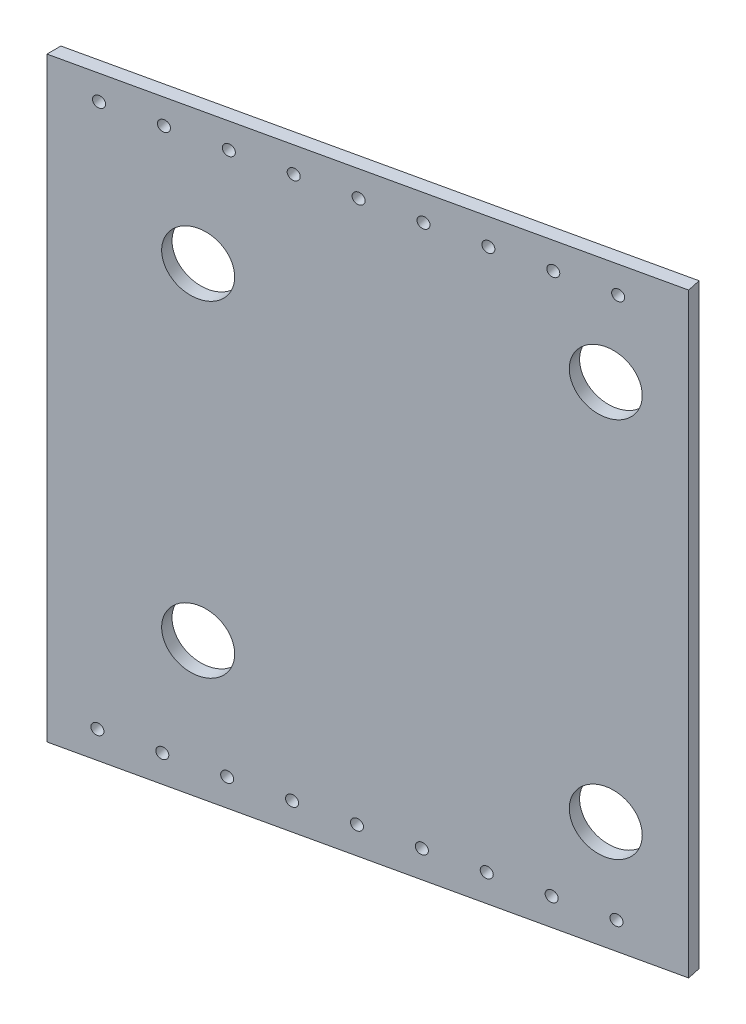
ISO-10303-21;
HEADER;
FILE_DESCRIPTION(('STEP AP214'),'2;1');
FILE_NAME('part.step','',(''),(''),'','','');
FILE_SCHEMA(('AUTOMOTIVE_DESIGN { 1 0 10303 214 1 1 1 1 }'));
ENDSEC;
DATA;
#1=APPLICATION_CONTEXT('core data for automotive mechanical design processes');
#2=APPLICATION_PROTOCOL_DEFINITION('international standard','automotive_design',2000,#1);
#3=PRODUCT_CONTEXT('',#1,'mechanical');
#4=PRODUCT('Part','Part','',(#3));
#5=PRODUCT_RELATED_PRODUCT_CATEGORY('part','',(#4));
#6=PRODUCT_DEFINITION_FORMATION('','',#4);
#7=PRODUCT_DEFINITION_CONTEXT('part definition',#1,'design');
#8=PRODUCT_DEFINITION('design','',#6,#7);
#9=PRODUCT_DEFINITION_SHAPE('','',#8);
#10=(LENGTH_UNIT() NAMED_UNIT(*) SI_UNIT(.MILLI.,.METRE.));
#11=(NAMED_UNIT(*) PLANE_ANGLE_UNIT() SI_UNIT($,.RADIAN.));
#12=(NAMED_UNIT(*) SI_UNIT($,.STERADIAN.) SOLID_ANGLE_UNIT());
#13=UNCERTAINTY_MEASURE_WITH_UNIT(LENGTH_MEASURE(1.E-05),#10,'distance_accuracy_value','');
#14=(GEOMETRIC_REPRESENTATION_CONTEXT(3) GLOBAL_UNCERTAINTY_ASSIGNED_CONTEXT((#13)) GLOBAL_UNIT_ASSIGNED_CONTEXT((#10,
#11,#12)) REPRESENTATION_CONTEXT('',''));
#15=CARTESIAN_POINT('',(0.,0.,0.));
#16=DIRECTION('',(0.,0.,1.));
#17=DIRECTION('',(1.,0.,0.));
#18=AXIS2_PLACEMENT_3D('',#15,#16,#17);
#19=CARTESIAN_POINT('',(713.576433805972,1247.05841028552,720.879061723581));
#20=DIRECTION('',(-0.976296007119933,0.,0.216439613938103));
#21=DIRECTION('',(0.,1.,0.));
#22=AXIS2_PLACEMENT_3D('',#19,#20,#21);
#23=PLANE('',#22);
#24=DIRECTION('',(0.,-1.,0.));
#25=VECTOR('',#24,1.);
#26=CARTESIAN_POINT('',(717.699608451493,1247.05841028552,739.477500659216));
#27=LINE('',#26,#25);
#28=CARTESIAN_POINT('',(717.699608451493,284.48,739.477500659216));
#29=VERTEX_POINT('',#28);
#30=CARTESIAN_POINT('',(717.699608451493,6.35,739.477500659216));
#31=VERTEX_POINT('',#30);
#32=EDGE_CURVE('E349',#29,#31,#27,.T.);
#33=ORIENTED_EDGE('',*,*,#32,.F.);
#34=DIRECTION('',(0.216439613938103,0.,0.976296007119933));
#35=VECTOR('',#34,1.);
#36=CARTESIAN_POINT('',(713.576433805972,284.48,720.879061723581));
#37=LINE('',#36,#35);
#38=CARTESIAN_POINT('',(719.074,284.48,745.676980304428));
#39=VERTEX_POINT('',#38);
#40=EDGE_CURVE('E25',#29,#39,#37,.T.);
#41=ORIENTED_EDGE('',*,*,#40,.T.);
#42=DIRECTION('',(0.,-1.,0.));
#43=VECTOR('',#42,1.);
#44=CARTESIAN_POINT('',(719.074,1247.05841028552,745.676980304428));
#45=LINE('',#44,#43);
#46=CARTESIAN_POINT('',(719.074,6.35,745.676980304428));
#47=VERTEX_POINT('',#46);
#48=EDGE_CURVE('E320',#39,#47,#45,.T.);
#49=ORIENTED_EDGE('',*,*,#48,.T.);
#50=DIRECTION('',(0.216439613938103,0.,0.976296007119933));
#51=VECTOR('',#50,1.);
#52=CARTESIAN_POINT('',(713.576433805972,6.35,720.879061723581));
#53=LINE('',#52,#51);
#54=EDGE_CURVE('E303',#31,#47,#53,.T.);
#55=ORIENTED_EDGE('',*,*,#54,.F.);
#56=EDGE_LOOP('',(#33,#41,#49,#55));
#57=FACE_BOUND('',#56,.T.);
#58=ADVANCED_FACE('F17',(#57),#23,.F.);
#59=CARTESIAN_POINT('',(537.832183892111,272.691741314654,759.840623919672));
#60=DIRECTION('',(0.216439613938103,0.,0.976296007119933));
#61=DIRECTION('',(0.976296007119933,0.,-0.216439613938103));
#62=AXIS2_PLACEMENT_3D('',#59,#60,#61);
#63=CYLINDRICAL_SURFACE('',#62,2.5527);
#64=CARTESIAN_POINT('',(541.955358537632,272.691741314654,778.439062855306));
#65=DIRECTION('',(-0.216439613938103,0.,-0.976296007119933));
#66=DIRECTION('',(0.976296007119933,0.,-0.216439613938103));
#67=AXIS2_PLACEMENT_3D('',#64,#65,#66);
#68=CIRCLE('',#67,2.5527);
#69=CARTESIAN_POINT('',(544.447549355007,272.691741314654,777.886557452806));
#70=VERTEX_POINT('',#69);
#71=EDGE_CURVE('E764',#70,#70,#68,.T.);
#72=ORIENTED_EDGE('',*,*,#71,.T.);
#73=EDGE_LOOP('',(#72));
#74=FACE_BOUND('',#73,.T.);
#75=CARTESIAN_POINT('',(543.329750086139,272.691741314654,784.638542500518));
#76=DIRECTION('',(0.216439613938103,0.,0.976296007119933));
#77=DIRECTION('',(-0.976296007119933,0.,0.216439613938103));
#78=AXIS2_PLACEMENT_3D('',#75,#76,#77);
#79=CIRCLE('',#78,2.5527);
#80=CARTESIAN_POINT('',(540.837559268764,272.691741314654,785.191047903018));
#81=VERTEX_POINT('',#80);
#82=EDGE_CURVE('E329',#81,#81,#79,.T.);
#83=ORIENTED_EDGE('',*,*,#82,.T.);
#84=EDGE_LOOP('',(#83));
#85=FACE_BOUND('',#84,.T.);
#86=ADVANCED_FACE('F449',(#74,#85),#63,.F.);
#87=CARTESIAN_POINT('',(587.427387168135,272.43490278426,748.845632060685));
#88=DIRECTION('',(0.216439613938103,0.,0.976296007119933));
#89=DIRECTION('',(0.976296007119933,0.,-0.216439613938103));
#90=AXIS2_PLACEMENT_3D('',#87,#88,#89);
#91=CYLINDRICAL_SURFACE('',#90,2.5527);
#92=CARTESIAN_POINT('',(591.550561813656,272.43490278426,767.44407099632));
#93=DIRECTION('',(-0.216439613938103,0.,-0.976296007119933));
#94=DIRECTION('',(0.976296007119933,0.,-0.216439613938103));
#95=AXIS2_PLACEMENT_3D('',#92,#93,#94);
#96=CIRCLE('',#95,2.5527);
#97=CARTESIAN_POINT('',(594.042752631031,272.43490278426,766.89156559382));
#98=VERTEX_POINT('',#97);
#99=EDGE_CURVE('E263',#98,#98,#96,.T.);
#100=ORIENTED_EDGE('',*,*,#99,.T.);
#101=EDGE_LOOP('',(#100));
#102=FACE_BOUND('',#101,.T.);
#103=CARTESIAN_POINT('',(592.924953362163,272.43490278426,773.643550641532));
#104=DIRECTION('',(0.216439613938103,0.,0.976296007119933));
#105=DIRECTION('',(-0.976296007119933,0.,0.216439613938103));
#106=AXIS2_PLACEMENT_3D('',#103,#104,#105);
#107=CIRCLE('',#106,2.5527);
#108=CARTESIAN_POINT('',(590.432762544788,272.43490278426,774.196056044032));
#109=VERTEX_POINT('',#108);
#110=EDGE_CURVE('E367',#109,#109,#107,.T.);
#111=ORIENTED_EDGE('',*,*,#110,.T.);
#112=EDGE_LOOP('',(#111));
#113=FACE_BOUND('',#112,.T.);
#114=ADVANCED_FACE('F453',(#102,#113),#91,.F.);
#115=CARTESIAN_POINT('',(637.022590444159,272.178064253868,737.850640201699));
#116=DIRECTION('',(0.216439613938103,0.,0.976296007119933));
#117=DIRECTION('',(0.976296007119933,0.,-0.216439613938103));
#118=AXIS2_PLACEMENT_3D('',#115,#116,#117);
#119=CYLINDRICAL_SURFACE('',#118,2.5527);
#120=CARTESIAN_POINT('',(641.14576508968,272.178064253868,756.449079137334));
#121=DIRECTION('',(-0.216439613938103,0.,-0.976296007119933));
#122=DIRECTION('',(0.976296007119933,0.,-0.216439613938103));
#123=AXIS2_PLACEMENT_3D('',#120,#121,#122);
#124=CIRCLE('',#123,2.5527);
#125=CARTESIAN_POINT('',(643.637955907055,272.178064253868,755.896573734834));
#126=VERTEX_POINT('',#125);
#127=EDGE_CURVE('E272',#126,#126,#124,.T.);
#128=ORIENTED_EDGE('',*,*,#127,.T.);
#129=EDGE_LOOP('',(#128));
#130=FACE_BOUND('',#129,.T.);
#131=CARTESIAN_POINT('',(642.520156638187,272.178064253868,762.648558782545));
#132=DIRECTION('',(0.216439613938103,0.,0.976296007119933));
#133=DIRECTION('',(-0.976296007119933,0.,0.216439613938103));
#134=AXIS2_PLACEMENT_3D('',#131,#132,#133);
#135=CIRCLE('',#134,2.5527);
#136=CARTESIAN_POINT('',(640.027965820812,272.178064253868,763.201064185045));
#137=VERTEX_POINT('',#136);
#138=EDGE_CURVE('E282',#137,#137,#135,.T.);
#139=ORIENTED_EDGE('',*,*,#138,.T.);
#140=EDGE_LOOP('',(#139));
#141=FACE_BOUND('',#140,.T.);
#142=ADVANCED_FACE('F458',(#130,#141),#119,.F.);
#143=CARTESIAN_POINT('',(686.617793720183,271.921225723475,726.855648342713));
#144=DIRECTION('',(0.216439613938103,0.,0.976296007119933));
#145=DIRECTION('',(0.976296007119933,0.,-0.216439613938103));
#146=AXIS2_PLACEMENT_3D('',#143,#144,#145);
#147=CYLINDRICAL_SURFACE('',#146,2.5527);
#148=CARTESIAN_POINT('',(690.740968365704,271.921225723475,745.454087278348));
#149=DIRECTION('',(-0.216439613938103,0.,-0.976296007119933));
#150=DIRECTION('',(0.976296007119933,0.,-0.216439613938103));
#151=AXIS2_PLACEMENT_3D('',#148,#149,#150);
#152=CIRCLE('',#151,2.5527);
#153=CARTESIAN_POINT('',(693.233159183079,271.921225723475,744.901581875848));
#154=VERTEX_POINT('',#153);
#155=EDGE_CURVE('E275',#154,#154,#152,.T.);
#156=ORIENTED_EDGE('',*,*,#155,.T.);
#157=EDGE_LOOP('',(#156));
#158=FACE_BOUND('',#157,.T.);
#159=CARTESIAN_POINT('',(692.115359914211,271.921225723475,751.653566923559));
#160=DIRECTION('',(0.216439613938103,0.,0.976296007119933));
#161=DIRECTION('',(-0.976296007119933,0.,0.216439613938103));
#162=AXIS2_PLACEMENT_3D('',#159,#160,#161);
#163=CIRCLE('',#162,2.5527);
#164=CARTESIAN_POINT('',(689.623169096836,271.921225723475,752.206072326059));
#165=VERTEX_POINT('',#164);
#166=EDGE_CURVE('E278',#165,#165,#163,.T.);
#167=ORIENTED_EDGE('',*,*,#166,.T.);
#168=EDGE_LOOP('',(#167));
#169=FACE_BOUND('',#168,.T.);
#170=ADVANCED_FACE('F465',(#158,#169),#147,.F.);
#171=CARTESIAN_POINT('',(661.820192082171,272.049644988671,732.353144272206));
#172=DIRECTION('',(0.216439613938103,0.,0.976296007119933));
#173=DIRECTION('',(0.976296007119933,0.,-0.216439613938103));
#174=AXIS2_PLACEMENT_3D('',#171,#172,#173);
#175=CYLINDRICAL_SURFACE('',#174,2.5527);
#176=CARTESIAN_POINT('',(665.943366727692,272.049644988671,750.951583207841));
#177=DIRECTION('',(-0.216439613938103,0.,-0.976296007119933));
#178=DIRECTION('',(0.976296007119933,0.,-0.216439613938103));
#179=AXIS2_PLACEMENT_3D('',#176,#177,#178);
#180=CIRCLE('',#179,2.5527);
#181=CARTESIAN_POINT('',(668.435557545067,272.049644988671,750.399077805341));
#182=VERTEX_POINT('',#181);
#183=EDGE_CURVE('E288',#182,#182,#180,.T.);
#184=ORIENTED_EDGE('',*,*,#183,.T.);
#185=EDGE_LOOP('',(#184));
#186=FACE_BOUND('',#185,.T.);
#187=CARTESIAN_POINT('',(667.317758276199,272.049644988671,757.151062853052));
#188=DIRECTION('',(0.216439613938103,0.,0.976296007119933));
#189=DIRECTION('',(-0.976296007119933,0.,0.216439613938103));
#190=AXIS2_PLACEMENT_3D('',#187,#188,#189);
#191=CIRCLE('',#190,2.5527);
#192=CARTESIAN_POINT('',(664.825567458824,272.049644988671,757.703568255552));
#193=VERTEX_POINT('',#192);
#194=EDGE_CURVE('E281',#193,#193,#191,.T.);
#195=ORIENTED_EDGE('',*,*,#194,.T.);
#196=EDGE_LOOP('',(#195));
#197=FACE_BOUND('',#196,.T.);
#198=ADVANCED_FACE('F469',(#186,#197),#175,.F.);
#199=CARTESIAN_POINT('',(612.224988806147,272.306483519064,743.348136131192));
#200=DIRECTION('',(0.216439613938103,0.,0.976296007119933));
#201=DIRECTION('',(0.976296007119933,0.,-0.216439613938103));
#202=AXIS2_PLACEMENT_3D('',#199,#200,#201);
#203=CYLINDRICAL_SURFACE('',#202,2.5527);
#204=CARTESIAN_POINT('',(616.348163451668,272.306483519064,761.946575066827));
#205=DIRECTION('',(-0.216439613938103,0.,-0.976296007119933));
#206=DIRECTION('',(0.976296007119933,0.,-0.216439613938103));
#207=AXIS2_PLACEMENT_3D('',#204,#205,#206);
#208=CIRCLE('',#207,2.5527);
#209=CARTESIAN_POINT('',(618.840354269043,272.306483519064,761.394069664327));
#210=VERTEX_POINT('',#209);
#211=EDGE_CURVE('E291',#210,#210,#208,.T.);
#212=ORIENTED_EDGE('',*,*,#211,.T.);
#213=EDGE_LOOP('',(#212));
#214=FACE_BOUND('',#213,.T.);
#215=CARTESIAN_POINT('',(617.722555000175,272.306483519064,768.146054712039));
#216=DIRECTION('',(0.216439613938103,0.,0.976296007119933));
#217=DIRECTION('',(-0.976296007119933,0.,0.216439613938103));
#218=AXIS2_PLACEMENT_3D('',#215,#216,#217);
#219=CIRCLE('',#218,2.5527);
#220=CARTESIAN_POINT('',(615.2303641828,272.306483519064,768.698560114539));
#221=VERTEX_POINT('',#220);
#222=EDGE_CURVE('E374',#221,#221,#219,.T.);
#223=ORIENTED_EDGE('',*,*,#222,.T.);
#224=EDGE_LOOP('',(#223));
#225=FACE_BOUND('',#224,.T.);
#226=ADVANCED_FACE('F473',(#214,#225),#203,.F.);
#227=CARTESIAN_POINT('',(562.629785530123,272.563322049457,754.343127990179));
#228=DIRECTION('',(0.216439613938103,0.,0.976296007119933));
#229=DIRECTION('',(0.976296007119933,0.,-0.216439613938103));
#230=AXIS2_PLACEMENT_3D('',#227,#228,#229);
#231=CYLINDRICAL_SURFACE('',#230,2.5527);
#232=CARTESIAN_POINT('',(566.752960175644,272.563322049457,772.941566925813));
#233=DIRECTION('',(-0.216439613938103,0.,-0.976296007119933));
#234=DIRECTION('',(0.976296007119933,0.,-0.216439613938103));
#235=AXIS2_PLACEMENT_3D('',#232,#233,#234);
#236=CIRCLE('',#235,2.5527);
#237=CARTESIAN_POINT('',(569.245150993019,272.563322049457,772.389061523313));
#238=VERTEX_POINT('',#237);
#239=EDGE_CURVE('E295',#238,#238,#236,.T.);
#240=ORIENTED_EDGE('',*,*,#239,.T.);
#241=EDGE_LOOP('',(#240));
#242=FACE_BOUND('',#241,.T.);
#243=CARTESIAN_POINT('',(568.127351724151,272.563322049457,779.141046571025));
#244=DIRECTION('',(0.216439613938103,0.,0.976296007119933));
#245=DIRECTION('',(-0.976296007119933,0.,0.216439613938103));
#246=AXIS2_PLACEMENT_3D('',#243,#244,#245);
#247=CIRCLE('',#246,2.5527);
#248=CARTESIAN_POINT('',(565.635160906776,272.563322049457,779.693551973525));
#249=VERTEX_POINT('',#248);
#250=EDGE_CURVE('E377',#249,#249,#247,.T.);
#251=ORIENTED_EDGE('',*,*,#250,.T.);
#252=EDGE_LOOP('',(#251));
#253=FACE_BOUND('',#252,.T.);
#254=ADVANCED_FACE('F475',(#242,#253),#231,.F.);
#255=CARTESIAN_POINT('',(513.034582254099,272.820160579849,765.338119849165));
#256=DIRECTION('',(0.216439613938103,0.,0.976296007119933));
#257=DIRECTION('',(0.976296007119933,0.,-0.216439613938103));
#258=AXIS2_PLACEMENT_3D('',#255,#256,#257);
#259=CYLINDRICAL_SURFACE('',#258,2.5527);
#260=CARTESIAN_POINT('',(517.15775689962,272.820160579849,783.936558784799));
#261=DIRECTION('',(-0.216439613938103,0.,-0.976296007119933));
#262=DIRECTION('',(0.976296007119933,0.,-0.216439613938103));
#263=AXIS2_PLACEMENT_3D('',#260,#261,#262);
#264=CIRCLE('',#263,2.5527);
#265=CARTESIAN_POINT('',(519.649947716995,272.820160579849,783.384053382299));
#266=VERTEX_POINT('',#265);
#267=EDGE_CURVE('E271',#266,#266,#264,.T.);
#268=ORIENTED_EDGE('',*,*,#267,.T.);
#269=EDGE_LOOP('',(#268));
#270=FACE_BOUND('',#269,.T.);
#271=CARTESIAN_POINT('',(518.532148448127,272.820160579849,790.136038430011));
#272=DIRECTION('',(0.216439613938103,0.,0.976296007119933));
#273=DIRECTION('',(-0.976296007119933,0.,0.216439613938103));
#274=AXIS2_PLACEMENT_3D('',#271,#272,#273);
#275=CIRCLE('',#274,2.5527);
#276=CARTESIAN_POINT('',(516.039957630752,272.820160579849,790.688543832511));
#277=VERTEX_POINT('',#276);
#278=EDGE_CURVE('E385',#277,#277,#275,.T.);
#279=ORIENTED_EDGE('',*,*,#278,.T.);
#280=EDGE_LOOP('',(#279));
#281=FACE_BOUND('',#280,.T.);
#282=ADVANCED_FACE('F478',(#270,#281),#259,.F.);
#283=CARTESIAN_POINT('',(685.993699485701,19.05,726.994006703484));
#284=DIRECTION('',(0.216439613938103,0.,0.976296007119933));
#285=DIRECTION('',(0.976296007119933,0.,-0.216439613938103));
#286=AXIS2_PLACEMENT_3D('',#283,#284,#285);
#287=CYLINDRICAL_SURFACE('',#286,2.5527);
#288=CARTESIAN_POINT('',(690.116874131222,19.05,745.592445639119));
#289=DIRECTION('',(0.216439613938103,0.,0.976296007119933));
#290=DIRECTION('',(0.976296007119933,0.,-0.216439613938103));
#291=AXIS2_PLACEMENT_3D('',#288,#289,#290);
#292=CIRCLE('',#291,2.5527);
#293=CARTESIAN_POINT('',(692.609064948597,19.05,745.039940236619));
#294=VERTEX_POINT('',#293);
#295=EDGE_CURVE('E342',#294,#294,#292,.T.);
#296=ORIENTED_EDGE('',*,*,#295,.F.);
#297=EDGE_LOOP('',(#296));
#298=FACE_BOUND('',#297,.T.);
#299=CARTESIAN_POINT('',(691.491265679729,19.05,751.79192528433));
#300=DIRECTION('',(0.216439613938103,0.,0.976296007119933));
#301=DIRECTION('',(0.976296007119933,0.,-0.216439613938103));
#302=AXIS2_PLACEMENT_3D('',#299,#300,#301);
#303=CIRCLE('',#302,2.5527);
#304=CARTESIAN_POINT('',(693.983456497104,19.05,751.23941988183));
#305=VERTEX_POINT('',#304);
#306=EDGE_CURVE('E35',#305,#305,#303,.T.);
#307=ORIENTED_EDGE('',*,*,#306,.T.);
#308=EDGE_LOOP('',(#307));
#309=FACE_BOUND('',#308,.T.);
#310=ADVANCED_FACE('F482',(#298,#309),#287,.F.);
#311=CARTESIAN_POINT('',(661.195780904854,19.05,732.491572897512));
#312=DIRECTION('',(0.216439613938103,0.,0.976296007119933));
#313=DIRECTION('',(0.976296007119933,0.,-0.216439613938103));
#314=AXIS2_PLACEMENT_3D('',#311,#312,#313);
#315=CYLINDRICAL_SURFACE('',#314,2.5527);
#316=CARTESIAN_POINT('',(665.318955550375,19.05,751.090011833146));
#317=DIRECTION('',(0.216439613938103,0.,0.976296007119933));
#318=DIRECTION('',(0.976296007119933,0.,-0.216439613938103));
#319=AXIS2_PLACEMENT_3D('',#316,#317,#318);
#320=CIRCLE('',#319,2.5527);
#321=CARTESIAN_POINT('',(667.81114636775,19.05,750.537506430646));
#322=VERTEX_POINT('',#321);
#323=EDGE_CURVE('E259',#322,#322,#320,.T.);
#324=ORIENTED_EDGE('',*,*,#323,.F.);
#325=EDGE_LOOP('',(#324));
#326=FACE_BOUND('',#325,.T.);
#327=CARTESIAN_POINT('',(666.693347098882,19.05,757.289491478358));
#328=DIRECTION('',(0.216439613938103,0.,0.976296007119933));
#329=DIRECTION('',(0.976296007119933,0.,-0.216439613938103));
#330=AXIS2_PLACEMENT_3D('',#327,#328,#329);
#331=CIRCLE('',#330,2.5527);
#332=CARTESIAN_POINT('',(669.185537916257,19.05,756.736986075858));
#333=VERTEX_POINT('',#332);
#334=EDGE_CURVE('E388',#333,#333,#331,.T.);
#335=ORIENTED_EDGE('',*,*,#334,.T.);
#336=EDGE_LOOP('',(#335));
#337=FACE_BOUND('',#336,.T.);
#338=ADVANCED_FACE('F486',(#326,#337),#315,.F.);
#339=CARTESIAN_POINT('',(636.397862324008,19.05,737.98913909154));
#340=DIRECTION('',(0.216439613938103,0.,0.976296007119933));
#341=DIRECTION('',(0.976296007119933,0.,-0.216439613938103));
#342=AXIS2_PLACEMENT_3D('',#339,#340,#341);
#343=CYLINDRICAL_SURFACE('',#342,2.5527);
#344=CARTESIAN_POINT('',(640.521036969529,19.05,756.587578027174));
#345=DIRECTION('',(0.216439613938103,0.,0.976296007119933));
#346=DIRECTION('',(0.976296007119933,0.,-0.216439613938103));
#347=AXIS2_PLACEMENT_3D('',#344,#345,#346);
#348=CIRCLE('',#347,2.5527);
#349=CARTESIAN_POINT('',(643.013227786904,19.05,756.035072624674));
#350=VERTEX_POINT('',#349);
#351=EDGE_CURVE('E339',#350,#350,#348,.T.);
#352=ORIENTED_EDGE('',*,*,#351,.F.);
#353=EDGE_LOOP('',(#352));
#354=FACE_BOUND('',#353,.T.);
#355=CARTESIAN_POINT('',(641.895428518036,19.05,762.787057672386));
#356=DIRECTION('',(0.216439613938103,0.,0.976296007119933));
#357=DIRECTION('',(0.976296007119933,0.,-0.216439613938103));
#358=AXIS2_PLACEMENT_3D('',#355,#356,#357);
#359=CIRCLE('',#358,2.5527);
#360=CARTESIAN_POINT('',(644.387619335411,19.05,762.234552269886));
#361=VERTEX_POINT('',#360);
#362=EDGE_CURVE('E42',#361,#361,#359,.T.);
#363=ORIENTED_EDGE('',*,*,#362,.T.);
#364=EDGE_LOOP('',(#363));
#365=FACE_BOUND('',#364,.T.);
#366=ADVANCED_FACE('F490',(#354,#365),#343,.F.);
#367=CARTESIAN_POINT('',(611.599943743162,19.05,743.486705285568));
#368=DIRECTION('',(0.216439613938103,0.,0.976296007119933));
#369=DIRECTION('',(0.976296007119933,0.,-0.216439613938103));
#370=AXIS2_PLACEMENT_3D('',#367,#368,#369);
#371=CYLINDRICAL_SURFACE('',#370,2.5527);
#372=CARTESIAN_POINT('',(615.723118388683,19.05,762.085144221202));
#373=DIRECTION('',(0.216439613938103,0.,0.976296007119933));
#374=DIRECTION('',(0.976296007119933,0.,-0.216439613938103));
#375=AXIS2_PLACEMENT_3D('',#372,#373,#374);
#376=CIRCLE('',#375,2.5527);
#377=CARTESIAN_POINT('',(618.215309206058,19.05,761.532638818702));
#378=VERTEX_POINT('',#377);
#379=EDGE_CURVE('E250',#378,#378,#376,.T.);
#380=ORIENTED_EDGE('',*,*,#379,.F.);
#381=EDGE_LOOP('',(#380));
#382=FACE_BOUND('',#381,.T.);
#383=CARTESIAN_POINT('',(617.09750993719,19.05,768.284623866414));
#384=DIRECTION('',(0.216439613938103,0.,0.976296007119933));
#385=DIRECTION('',(0.976296007119933,0.,-0.216439613938103));
#386=AXIS2_PLACEMENT_3D('',#383,#384,#385);
#387=CIRCLE('',#386,2.5527);
#388=CARTESIAN_POINT('',(619.589700754565,19.05,767.732118463914));
#389=VERTEX_POINT('',#388);
#390=EDGE_CURVE('E391',#389,#389,#387,.T.);
#391=ORIENTED_EDGE('',*,*,#390,.T.);
#392=EDGE_LOOP('',(#391));
#393=FACE_BOUND('',#392,.T.);
#394=ADVANCED_FACE('F494',(#382,#393),#371,.F.);
#395=CARTESIAN_POINT('',(586.802025162316,19.05,748.984271479595));
#396=DIRECTION('',(0.216439613938103,0.,0.976296007119933));
#397=DIRECTION('',(0.976296007119933,0.,-0.216439613938103));
#398=AXIS2_PLACEMENT_3D('',#395,#396,#397);
#399=CYLINDRICAL_SURFACE('',#398,2.5527);
#400=CARTESIAN_POINT('',(590.925199807836,19.05,767.58271041523));
#401=DIRECTION('',(0.216439613938103,0.,0.976296007119933));
#402=DIRECTION('',(0.976296007119933,0.,-0.216439613938103));
#403=AXIS2_PLACEMENT_3D('',#400,#401,#402);
#404=CIRCLE('',#403,2.5527);
#405=CARTESIAN_POINT('',(593.417390625211,19.05,767.03020501273));
#406=VERTEX_POINT('',#405);
#407=EDGE_CURVE('E336',#406,#406,#404,.T.);
#408=ORIENTED_EDGE('',*,*,#407,.F.);
#409=EDGE_LOOP('',(#408));
#410=FACE_BOUND('',#409,.T.);
#411=CARTESIAN_POINT('',(592.299591356343,19.05,773.782190060442));
#412=DIRECTION('',(0.216439613938103,0.,0.976296007119933));
#413=DIRECTION('',(0.976296007119933,0.,-0.216439613938103));
#414=AXIS2_PLACEMENT_3D('',#411,#412,#413);
#415=CIRCLE('',#414,2.5527);
#416=CARTESIAN_POINT('',(594.791782173718,19.05,773.229684657942));
#417=VERTEX_POINT('',#416);
#418=EDGE_CURVE('E355',#417,#417,#415,.T.);
#419=ORIENTED_EDGE('',*,*,#418,.T.);
#420=EDGE_LOOP('',(#419));
#421=FACE_BOUND('',#420,.T.);
#422=ADVANCED_FACE('F498',(#410,#421),#399,.F.);
#423=CARTESIAN_POINT('',(562.004106581469,19.05,754.481837673623));
#424=DIRECTION('',(0.216439613938103,0.,0.976296007119933));
#425=DIRECTION('',(0.976296007119933,0.,-0.216439613938103));
#426=AXIS2_PLACEMENT_3D('',#423,#424,#425);
#427=CYLINDRICAL_SURFACE('',#426,2.5527);
#428=CARTESIAN_POINT('',(566.12728122699,19.05,773.080276609258));
#429=DIRECTION('',(0.216439613938103,0.,0.976296007119933));
#430=DIRECTION('',(0.976296007119933,0.,-0.216439613938103));
#431=AXIS2_PLACEMENT_3D('',#428,#429,#430);
#432=CIRCLE('',#431,2.5527);
#433=CARTESIAN_POINT('',(568.619472044365,19.05,772.527771206758));
#434=VERTEX_POINT('',#433);
#435=EDGE_CURVE('E244',#434,#434,#432,.T.);
#436=ORIENTED_EDGE('',*,*,#435,.F.);
#437=EDGE_LOOP('',(#436));
#438=FACE_BOUND('',#437,.T.);
#439=CARTESIAN_POINT('',(567.501672775497,19.05,779.279756254469));
#440=DIRECTION('',(0.216439613938103,0.,0.976296007119933));
#441=DIRECTION('',(0.976296007119933,0.,-0.216439613938103));
#442=AXIS2_PLACEMENT_3D('',#439,#440,#441);
#443=CIRCLE('',#442,2.5527);
#444=CARTESIAN_POINT('',(569.993863592872,19.05,778.727250851969));
#445=VERTEX_POINT('',#444);
#446=EDGE_CURVE('E394',#445,#445,#443,.T.);
#447=ORIENTED_EDGE('',*,*,#446,.T.);
#448=EDGE_LOOP('',(#447));
#449=FACE_BOUND('',#448,.T.);
#450=ADVANCED_FACE('F502',(#438,#449),#427,.F.);
#451=CARTESIAN_POINT('',(537.206188000623,19.05,759.979403867651));
#452=DIRECTION('',(0.216439613938103,0.,0.976296007119933));
#453=DIRECTION('',(0.976296007119933,0.,-0.216439613938103));
#454=AXIS2_PLACEMENT_3D('',#451,#452,#453);
#455=CYLINDRICAL_SURFACE('',#454,2.5527);
#456=CARTESIAN_POINT('',(541.329362646144,19.05,778.577842803285));
#457=DIRECTION('',(0.216439613938103,0.,0.976296007119933));
#458=DIRECTION('',(0.976296007119933,0.,-0.216439613938103));
#459=AXIS2_PLACEMENT_3D('',#456,#457,#458);
#460=CIRCLE('',#459,2.5527);
#461=CARTESIAN_POINT('',(543.821553463519,19.05,778.025337400785));
#462=VERTEX_POINT('',#461);
#463=EDGE_CURVE('E333',#462,#462,#460,.T.);
#464=ORIENTED_EDGE('',*,*,#463,.F.);
#465=EDGE_LOOP('',(#464));
#466=FACE_BOUND('',#465,.T.);
#467=CARTESIAN_POINT('',(542.703754194651,19.05,784.777322448497));
#468=DIRECTION('',(0.216439613938103,0.,0.976296007119933));
#469=DIRECTION('',(0.976296007119933,0.,-0.216439613938103));
#470=AXIS2_PLACEMENT_3D('',#467,#468,#469);
#471=CIRCLE('',#470,2.5527);
#472=CARTESIAN_POINT('',(545.195945012026,19.05,784.224817045997));
#473=VERTEX_POINT('',#472);
#474=EDGE_CURVE('E313',#473,#473,#471,.T.);
#475=ORIENTED_EDGE('',*,*,#474,.T.);
#476=EDGE_LOOP('',(#475));
#477=FACE_BOUND('',#476,.T.);
#478=ADVANCED_FACE('F510',(#466,#477),#455,.F.);
#479=CARTESIAN_POINT('',(512.408269419777,19.05,765.476970061679));
#480=DIRECTION('',(0.216439613938103,0.,0.976296007119933));
#481=DIRECTION('',(0.976296007119933,0.,-0.216439613938103));
#482=AXIS2_PLACEMENT_3D('',#479,#480,#481);
#483=CYLINDRICAL_SURFACE('',#482,2.5527);
#484=CARTESIAN_POINT('',(516.531444065298,19.05,784.075408997313));
#485=DIRECTION('',(0.216439613938103,0.,0.976296007119933));
#486=DIRECTION('',(0.976296007119933,0.,-0.216439613938103));
#487=AXIS2_PLACEMENT_3D('',#484,#485,#486);
#488=CIRCLE('',#487,2.5527);
#489=CARTESIAN_POINT('',(519.023634882673,19.05,783.522903594813));
#490=VERTEX_POINT('',#489);
#491=EDGE_CURVE('E249',#490,#490,#488,.T.);
#492=ORIENTED_EDGE('',*,*,#491,.F.);
#493=EDGE_LOOP('',(#492));
#494=FACE_BOUND('',#493,.T.);
#495=CARTESIAN_POINT('',(517.905835613805,19.05,790.274888642525));
#496=DIRECTION('',(0.216439613938103,0.,0.976296007119933));
#497=DIRECTION('',(0.976296007119933,0.,-0.216439613938103));
#498=AXIS2_PLACEMENT_3D('',#495,#496,#497);
#499=CIRCLE('',#498,2.5527);
#500=CARTESIAN_POINT('',(520.39802643118,19.05,789.722383240025));
#501=VERTEX_POINT('',#500);
#502=EDGE_CURVE('E268',#501,#501,#499,.T.);
#503=ORIENTED_EDGE('',*,*,#502,.T.);
#504=EDGE_LOOP('',(#503));
#505=FACE_BOUND('',#504,.T.);
#506=ADVANCED_FACE('F508',(#494,#505),#483,.F.);
#507=CARTESIAN_POINT('',(487.610350838931,19.05,770.974536255707));
#508=DIRECTION('',(0.216439613938103,0.,0.976296007119933));
#509=DIRECTION('',(0.976296007119933,0.,-0.216439613938103));
#510=AXIS2_PLACEMENT_3D('',#507,#508,#509);
#511=CYLINDRICAL_SURFACE('',#510,2.5527);
#512=CARTESIAN_POINT('',(491.733525484451,19.05,789.572975191341));
#513=DIRECTION('',(0.216439613938103,0.,0.976296007119933));
#514=DIRECTION('',(0.976296007119933,0.,-0.216439613938103));
#515=AXIS2_PLACEMENT_3D('',#512,#513,#514);
#516=CIRCLE('',#515,2.5527);
#517=CARTESIAN_POINT('',(494.225716301826,19.05,789.020469788841));
#518=VERTEX_POINT('',#517);
#519=EDGE_CURVE('E286',#518,#518,#516,.T.);
#520=ORIENTED_EDGE('',*,*,#519,.F.);
#521=EDGE_LOOP('',(#520));
#522=FACE_BOUND('',#521,.T.);
#523=CARTESIAN_POINT('',(493.107917032958,19.05,795.772454836553));
#524=DIRECTION('',(0.216439613938103,0.,0.976296007119933));
#525=DIRECTION('',(0.976296007119933,0.,-0.216439613938103));
#526=AXIS2_PLACEMENT_3D('',#523,#524,#525);
#527=CIRCLE('',#526,2.5527);
#528=CARTESIAN_POINT('',(495.600107850333,19.05,795.219949434053));
#529=VERTEX_POINT('',#528);
#530=EDGE_CURVE('E311',#529,#529,#527,.T.);
#531=ORIENTED_EDGE('',*,*,#530,.T.);
#532=EDGE_LOOP('',(#531));
#533=FACE_BOUND('',#532,.T.);
#534=ADVANCED_FACE('F504',(#522,#533),#511,.F.);
#535=CARTESIAN_POINT('',(526.122749550986,222.25,762.436543015667));
#536=DIRECTION('',(0.216439613938103,0.,0.976296007119933));
#537=DIRECTION('',(0.976296007119933,0.,-0.216439613938103));
#538=AXIS2_PLACEMENT_3D('',#535,#536,#537);
#539=CYLINDRICAL_SURFACE('',#538,14.2875);
#540=CARTESIAN_POINT('',(530.245924196506,222.25,781.034981951302));
#541=DIRECTION('',(0.216439613938103,0.,0.976296007119933));
#542=DIRECTION('',(0.976296007119933,0.,-0.216439613938103));
#543=AXIS2_PLACEMENT_3D('',#540,#541,#542);
#544=CIRCLE('',#543,14.2875);
#545=CARTESIAN_POINT('',(544.194753398232,222.25,777.942600967161));
#546=VERTEX_POINT('',#545);
#547=EDGE_CURVE('E256',#546,#546,#544,.T.);
#548=ORIENTED_EDGE('',*,*,#547,.F.);
#549=EDGE_LOOP('',(#548));
#550=FACE_BOUND('',#549,.T.);
#551=CARTESIAN_POINT('',(531.620315745013,222.25,787.234461596513));
#552=DIRECTION('',(0.216439613938103,0.,0.976296007119933));
#553=DIRECTION('',(0.976296007119933,0.,-0.216439613938103));
#554=AXIS2_PLACEMENT_3D('',#551,#552,#553);
#555=CIRCLE('',#554,14.2875);
#556=CARTESIAN_POINT('',(545.569144946739,222.25,784.142080612372));
#557=VERTEX_POINT('',#556);
#558=EDGE_CURVE('E265',#557,#557,#555,.T.);
#559=ORIENTED_EDGE('',*,*,#558,.T.);
#560=EDGE_LOOP('',(#559));
#561=FACE_BOUND('',#560,.T.);
#562=ADVANCED_FACE('F507',(#550,#561),#539,.F.);
#563=CARTESIAN_POINT('',(681.877122128731,234.95,727.906629931881));
#564=DIRECTION('',(0.216439613938103,0.,0.976296007119933));
#565=DIRECTION('',(0.976296007119933,0.,-0.216439613938103));
#566=AXIS2_PLACEMENT_3D('',#563,#564,#565);
#567=CYLINDRICAL_SURFACE('',#566,14.2875);
#568=CARTESIAN_POINT('',(686.000296774252,234.95,746.505068867516));
#569=DIRECTION('',(0.216439613938103,0.,0.976296007119933));
#570=DIRECTION('',(0.976296007119933,0.,-0.216439613938103));
#571=AXIS2_PLACEMENT_3D('',#568,#569,#570);
#572=CIRCLE('',#571,14.2875);
#573=CARTESIAN_POINT('',(699.949125975978,234.95,743.412687883375));
#574=VERTEX_POINT('',#573);
#575=EDGE_CURVE('E283',#574,#574,#572,.T.);
#576=ORIENTED_EDGE('',*,*,#575,.F.);
#577=EDGE_LOOP('',(#576));
#578=FACE_BOUND('',#577,.T.);
#579=CARTESIAN_POINT('',(687.374688322759,234.95,752.704548512727));
#580=DIRECTION('',(0.216439613938103,0.,0.976296007119933));
#581=DIRECTION('',(0.976296007119933,0.,-0.216439613938103));
#582=AXIS2_PLACEMENT_3D('',#579,#580,#581);
#583=CIRCLE('',#582,14.2875);
#584=CARTESIAN_POINT('',(701.323517524485,234.95,749.612167528586));
#585=VERTEX_POINT('',#584);
#586=EDGE_CURVE('E314',#585,#585,#583,.T.);
#587=ORIENTED_EDGE('',*,*,#586,.T.);
#588=EDGE_LOOP('',(#587));
#589=FACE_BOUND('',#588,.T.);
#590=ADVANCED_FACE('F514',(#578,#589),#567,.F.);
#591=CARTESIAN_POINT('',(681.877122128731,57.15,727.906629931881));
#592=DIRECTION('',(0.216439613938103,0.,0.976296007119933));
#593=DIRECTION('',(0.976296007119933,0.,-0.216439613938103));
#594=AXIS2_PLACEMENT_3D('',#591,#592,#593);
#595=CYLINDRICAL_SURFACE('',#594,14.2875);
#596=CARTESIAN_POINT('',(686.000296774252,57.15,746.505068867516));
#597=DIRECTION('',(0.216439613938103,0.,0.976296007119933));
#598=DIRECTION('',(0.976296007119933,0.,-0.216439613938103));
#599=AXIS2_PLACEMENT_3D('',#596,#597,#598);
#600=CIRCLE('',#599,14.2875);
#601=CARTESIAN_POINT('',(699.949125975978,57.15,743.412687883375));
#602=VERTEX_POINT('',#601);
#603=EDGE_CURVE('E305',#602,#602,#600,.T.);
#604=ORIENTED_EDGE('',*,*,#603,.F.);
#605=EDGE_LOOP('',(#604));
#606=FACE_BOUND('',#605,.T.);
#607=CARTESIAN_POINT('',(687.374688322759,57.15,752.704548512727));
#608=DIRECTION('',(0.216439613938103,0.,0.976296007119933));
#609=DIRECTION('',(0.976296007119933,0.,-0.216439613938103));
#610=AXIS2_PLACEMENT_3D('',#607,#608,#609);
#611=CIRCLE('',#610,14.2875);
#612=CARTESIAN_POINT('',(701.323517524485,57.15,749.612167528586));
#613=VERTEX_POINT('',#612);
#614=EDGE_CURVE('E267',#613,#613,#611,.T.);
#615=ORIENTED_EDGE('',*,*,#614,.T.);
#616=EDGE_LOOP('',(#615));
#617=FACE_BOUND('',#616,.T.);
#618=ADVANCED_FACE('F517',(#606,#617),#595,.F.);
#619=CARTESIAN_POINT('',(526.122749550986,69.85,762.436543015667));
#620=DIRECTION('',(0.216439613938103,0.,0.976296007119933));
#621=DIRECTION('',(0.976296007119933,0.,-0.216439613938103));
#622=AXIS2_PLACEMENT_3D('',#619,#620,#621);
#623=CYLINDRICAL_SURFACE('',#622,14.2875);
#624=CARTESIAN_POINT('',(530.245924196506,69.85,781.034981951302));
#625=DIRECTION('',(0.216439613938103,0.,0.976296007119933));
#626=DIRECTION('',(0.976296007119933,0.,-0.216439613938103));
#627=AXIS2_PLACEMENT_3D('',#624,#625,#626);
#628=CIRCLE('',#627,14.2875);
#629=CARTESIAN_POINT('',(544.194753398232,69.85,777.942600967161));
#630=VERTEX_POINT('',#629);
#631=EDGE_CURVE('E287',#630,#630,#628,.T.);
#632=ORIENTED_EDGE('',*,*,#631,.F.);
#633=EDGE_LOOP('',(#632));
#634=FACE_BOUND('',#633,.T.);
#635=CARTESIAN_POINT('',(531.620315745013,69.85,787.234461596513));
#636=DIRECTION('',(0.216439613938103,0.,0.976296007119933));
#637=DIRECTION('',(0.976296007119933,0.,-0.216439613938103));
#638=AXIS2_PLACEMENT_3D('',#635,#636,#637);
#639=CIRCLE('',#638,14.2875);
#640=CARTESIAN_POINT('',(545.569144946739,69.85,784.142080612372));
#641=VERTEX_POINT('',#640);
#642=EDGE_CURVE('E381',#641,#641,#639,.T.);
#643=ORIENTED_EDGE('',*,*,#642,.T.);
#644=EDGE_LOOP('',(#643));
#645=FACE_BOUND('',#644,.T.);
#646=ADVANCED_FACE('F445',(#634,#645),#623,.F.);
#647=CARTESIAN_POINT('',(488.236980616087,272.948579845046,770.835615778658));
#648=DIRECTION('',(0.216439613938103,0.,0.976296007119933));
#649=DIRECTION('',(0.976296007119933,0.,-0.216439613938103));
#650=AXIS2_PLACEMENT_3D('',#647,#648,#649);
#651=CYLINDRICAL_SURFACE('',#650,2.5527);
#652=CARTESIAN_POINT('',(492.360155261608,272.948579845046,789.434054714292));
#653=DIRECTION('',(-0.216439613938103,0.,-0.976296007119933));
#654=DIRECTION('',(0.976296007119933,0.,-0.216439613938103));
#655=AXIS2_PLACEMENT_3D('',#652,#653,#654);
#656=CIRCLE('',#655,2.5527);
#657=CARTESIAN_POINT('',(494.852346078983,272.948579845046,788.881549311792));
#658=VERTEX_POINT('',#657);
#659=EDGE_CURVE('E308',#658,#658,#656,.T.);
#660=ORIENTED_EDGE('',*,*,#659,.T.);
#661=EDGE_LOOP('',(#660));
#662=FACE_BOUND('',#661,.T.);
#663=CARTESIAN_POINT('',(493.734546810115,272.948579845046,795.633534359504));
#664=DIRECTION('',(0.216439613938103,0.,0.976296007119933));
#665=DIRECTION('',(-0.976296007119933,0.,0.216439613938103));
#666=AXIS2_PLACEMENT_3D('',#663,#664,#665);
#667=CIRCLE('',#666,2.5527);
#668=CARTESIAN_POINT('',(491.24235599274,272.948579845046,796.186039762004));
#669=VERTEX_POINT('',#668);
#670=EDGE_CURVE('E378',#669,#669,#667,.T.);
#671=ORIENTED_EDGE('',*,*,#670,.T.);
#672=EDGE_LOOP('',(#671));
#673=FACE_BOUND('',#672,.T.);
#674=ADVANCED_FACE('F437',(#662,#673),#651,.F.);
#675=CARTESIAN_POINT('',(473.837,1247.05841028552,503.822670694783));
#676=DIRECTION('',(1.,0.,0.));
#677=DIRECTION('',(0.,1.,0.));
#678=AXIS2_PLACEMENT_3D('',#675,#676,#677);
#679=PLANE('',#678);
#680=DIRECTION('',(0.,-1.,0.));
#681=VECTOR('',#680,1.);
#682=CARTESIAN_POINT('',(473.837,1247.05841028552,800.044714286994));
#683=LINE('',#682,#681);
#684=CARTESIAN_POINT('',(473.837,284.48,800.044714286994));
#685=VERTEX_POINT('',#684);
#686=CARTESIAN_POINT('',(473.837,6.35,800.044714286994));
#687=VERTEX_POINT('',#686);
#688=EDGE_CURVE('E382',#685,#687,#683,.T.);
#689=ORIENTED_EDGE('',*,*,#688,.F.);
#690=DIRECTION('',(0.,0.,-1.));
#691=VECTOR('',#690,1.);
#692=CARTESIAN_POINT('',(473.837,284.48,503.822670694783));
#693=LINE('',#692,#691);
#694=CARTESIAN_POINT('',(473.837,284.48,793.540539371097));
#695=VERTEX_POINT('',#694);
#696=EDGE_CURVE('E11',#685,#695,#693,.T.);
#697=ORIENTED_EDGE('',*,*,#696,.T.);
#698=DIRECTION('',(0.,-1.,0.));
#699=VECTOR('',#698,1.);
#700=CARTESIAN_POINT('',(473.837,1247.05841028552,793.540539371097));
#701=LINE('',#700,#699);
#702=CARTESIAN_POINT('',(473.837,6.35,793.540539371097));
#703=VERTEX_POINT('',#702);
#704=EDGE_CURVE('E299',#695,#703,#701,.T.);
#705=ORIENTED_EDGE('',*,*,#704,.T.);
#706=DIRECTION('',(0.,0.,1.));
#707=VECTOR('',#706,1.);
#708=CARTESIAN_POINT('',(473.837,6.35,503.822670694783));
#709=LINE('',#708,#707);
#710=EDGE_CURVE('E325',#703,#687,#709,.T.);
#711=ORIENTED_EDGE('',*,*,#710,.T.);
#712=EDGE_LOOP('',(#689,#697,#705,#711));
#713=FACE_BOUND('',#712,.T.);
#714=ADVANCED_FACE('F435',(#713),#679,.F.);
#715=CARTESIAN_POINT('',(359.537,284.48,615.315));
#716=DIRECTION('',(0.,-1.,0.));
#717=DIRECTION('',(0.,0.,-1.));
#718=AXIS2_PLACEMENT_3D('',#715,#716,#717);
#719=PLANE('',#718);
#720=ORIENTED_EDGE('',*,*,#40,.F.);
#721=DIRECTION('',(0.976296007119933,0.,-0.216439613938103));
#722=VECTOR('',#721,1.);
#723=CARTESIAN_POINT('',(596.4555,284.48,766.356672379814));
#724=LINE('',#723,#722);
#725=EDGE_CURVE('E345',#695,#29,#724,.T.);
#726=ORIENTED_EDGE('',*,*,#725,.F.);
#727=ORIENTED_EDGE('',*,*,#696,.F.);
#728=DIRECTION('',(-0.976296007119933,0.,0.216439613938103));
#729=VECTOR('',#728,1.);
#730=CARTESIAN_POINT('',(596.4555,284.48,772.860847295711));
#731=LINE('',#730,#729);
#732=EDGE_CURVE('E397',#39,#685,#731,.T.);
#733=ORIENTED_EDGE('',*,*,#732,.F.);
#734=EDGE_LOOP('',(#720,#726,#727,#733));
#735=FACE_BOUND('',#734,.T.);
#736=ADVANCED_FACE('F422',(#735),#719,.F.);
#737=CARTESIAN_POINT('',(596.4555,1247.05841028552,772.860847295711));
#738=DIRECTION('',(-0.216439613938103,0.,-0.976296007119933));
#739=DIRECTION('',(-0.976296007119933,0.,0.216439613938103));
#740=AXIS2_PLACEMENT_3D('',#737,#738,#739);
#741=PLANE('',#740);
#742=ORIENTED_EDGE('',*,*,#306,.F.);
#743=EDGE_LOOP('',(#742));
#744=FACE_BOUND('',#743,.T.);
#745=ORIENTED_EDGE('',*,*,#362,.F.);
#746=EDGE_LOOP('',(#745));
#747=FACE_BOUND('',#746,.T.);
#748=ORIENTED_EDGE('',*,*,#418,.F.);
#749=EDGE_LOOP('',(#748));
#750=FACE_BOUND('',#749,.T.);
#751=ORIENTED_EDGE('',*,*,#474,.F.);
#752=EDGE_LOOP('',(#751));
#753=FACE_BOUND('',#752,.T.);
#754=ORIENTED_EDGE('',*,*,#530,.F.);
#755=EDGE_LOOP('',(#754));
#756=FACE_BOUND('',#755,.T.);
#757=ORIENTED_EDGE('',*,*,#586,.F.);
#758=EDGE_LOOP('',(#757));
#759=FACE_BOUND('',#758,.T.);
#760=ORIENTED_EDGE('',*,*,#642,.F.);
#761=EDGE_LOOP('',(#760));
#762=FACE_BOUND('',#761,.T.);
#763=ORIENTED_EDGE('',*,*,#670,.F.);
#764=EDGE_LOOP('',(#763));
#765=FACE_BOUND('',#764,.T.);
#766=ORIENTED_EDGE('',*,*,#48,.F.);
#767=ORIENTED_EDGE('',*,*,#732,.T.);
#768=ORIENTED_EDGE('',*,*,#688,.T.);
#769=DIRECTION('',(0.976296007119933,0.,-0.216439613938103));
#770=VECTOR('',#769,1.);
#771=CARTESIAN_POINT('',(596.4555,6.35,772.860847295711));
#772=LINE('',#771,#770);
#773=EDGE_CURVE('E330',#687,#47,#772,.T.);
#774=ORIENTED_EDGE('',*,*,#773,.T.);
#775=EDGE_LOOP('',(#766,#767,#768,#774));
#776=FACE_BOUND('',#775,.T.);
#777=ORIENTED_EDGE('',*,*,#614,.F.);
#778=EDGE_LOOP('',(#777));
#779=FACE_BOUND('',#778,.T.);
#780=ORIENTED_EDGE('',*,*,#558,.F.);
#781=EDGE_LOOP('',(#780));
#782=FACE_BOUND('',#781,.T.);
#783=ORIENTED_EDGE('',*,*,#502,.F.);
#784=EDGE_LOOP('',(#783));
#785=FACE_BOUND('',#784,.T.);
#786=ORIENTED_EDGE('',*,*,#446,.F.);
#787=EDGE_LOOP('',(#786));
#788=FACE_BOUND('',#787,.T.);
#789=ORIENTED_EDGE('',*,*,#390,.F.);
#790=EDGE_LOOP('',(#789));
#791=FACE_BOUND('',#790,.T.);
#792=ORIENTED_EDGE('',*,*,#334,.F.);
#793=EDGE_LOOP('',(#792));
#794=FACE_BOUND('',#793,.T.);
#795=ORIENTED_EDGE('',*,*,#278,.F.);
#796=EDGE_LOOP('',(#795));
#797=FACE_BOUND('',#796,.T.);
#798=ORIENTED_EDGE('',*,*,#250,.F.);
#799=EDGE_LOOP('',(#798));
#800=FACE_BOUND('',#799,.T.);
#801=ORIENTED_EDGE('',*,*,#222,.F.);
#802=EDGE_LOOP('',(#801));
#803=FACE_BOUND('',#802,.T.);
#804=ORIENTED_EDGE('',*,*,#194,.F.);
#805=EDGE_LOOP('',(#804));
#806=FACE_BOUND('',#805,.T.);
#807=ORIENTED_EDGE('',*,*,#166,.F.);
#808=EDGE_LOOP('',(#807));
#809=FACE_BOUND('',#808,.T.);
#810=ORIENTED_EDGE('',*,*,#138,.F.);
#811=EDGE_LOOP('',(#810));
#812=FACE_BOUND('',#811,.T.);
#813=ORIENTED_EDGE('',*,*,#110,.F.);
#814=EDGE_LOOP('',(#813));
#815=FACE_BOUND('',#814,.T.);
#816=ORIENTED_EDGE('',*,*,#82,.F.);
#817=EDGE_LOOP('',(#816));
#818=FACE_BOUND('',#817,.T.);
#819=ADVANCED_FACE('F425',(#744,#747,#750,#753,#756,#759,#762,#765,#776,#779,#782,#785,#788,
#791,#794,#797,#800,#803,#806,#809,#812,#815,#818),#741,.F.);
#820=CARTESIAN_POINT('',(564.7055,6.35,508.924857143497));
#821=DIRECTION('',(0.,1.,0.));
#822=DIRECTION('',(1.,0.,0.));
#823=AXIS2_PLACEMENT_3D('',#820,#821,#822);
#824=PLANE('',#823);
#825=DIRECTION('',(-0.976296007119933,0.,0.216439613938103));
#826=VECTOR('',#825,1.);
#827=CARTESIAN_POINT('',(596.4555,6.35,766.356672379814));
#828=LINE('',#827,#826);
#829=EDGE_CURVE('E304',#31,#703,#828,.T.);
#830=ORIENTED_EDGE('',*,*,#829,.F.);
#831=ORIENTED_EDGE('',*,*,#54,.T.);
#832=ORIENTED_EDGE('',*,*,#773,.F.);
#833=ORIENTED_EDGE('',*,*,#710,.F.);
#834=EDGE_LOOP('',(#830,#831,#832,#833));
#835=FACE_BOUND('',#834,.T.);
#836=ADVANCED_FACE('F430',(#835),#824,.F.);
#837=CARTESIAN_POINT('',(596.4555,1247.05841028552,766.356672379814));
#838=DIRECTION('',(0.216439613938103,0.,0.976296007119933));
#839=DIRECTION('',(0.,-1.,0.));
#840=AXIS2_PLACEMENT_3D('',#837,#838,#839);
#841=PLANE('',#840);
#842=ORIENTED_EDGE('',*,*,#725,.T.);
#843=ORIENTED_EDGE('',*,*,#32,.T.);
#844=ORIENTED_EDGE('',*,*,#829,.T.);
#845=ORIENTED_EDGE('',*,*,#704,.F.);
#846=EDGE_LOOP('',(#842,#843,#844,#845));
#847=FACE_BOUND('',#846,.T.);
#848=ORIENTED_EDGE('',*,*,#295,.T.);
#849=EDGE_LOOP('',(#848));
#850=FACE_BOUND('',#849,.T.);
#851=ORIENTED_EDGE('',*,*,#351,.T.);
#852=EDGE_LOOP('',(#851));
#853=FACE_BOUND('',#852,.T.);
#854=ORIENTED_EDGE('',*,*,#407,.T.);
#855=EDGE_LOOP('',(#854));
#856=FACE_BOUND('',#855,.T.);
#857=ORIENTED_EDGE('',*,*,#463,.T.);
#858=EDGE_LOOP('',(#857));
#859=FACE_BOUND('',#858,.T.);
#860=ORIENTED_EDGE('',*,*,#519,.T.);
#861=EDGE_LOOP('',(#860));
#862=FACE_BOUND('',#861,.T.);
#863=ORIENTED_EDGE('',*,*,#575,.T.);
#864=EDGE_LOOP('',(#863));
#865=FACE_BOUND('',#864,.T.);
#866=ORIENTED_EDGE('',*,*,#631,.T.);
#867=EDGE_LOOP('',(#866));
#868=FACE_BOUND('',#867,.T.);
#869=ORIENTED_EDGE('',*,*,#659,.F.);
#870=EDGE_LOOP('',(#869));
#871=FACE_BOUND('',#870,.T.);
#872=ORIENTED_EDGE('',*,*,#603,.T.);
#873=EDGE_LOOP('',(#872));
#874=FACE_BOUND('',#873,.T.);
#875=ORIENTED_EDGE('',*,*,#547,.T.);
#876=EDGE_LOOP('',(#875));
#877=FACE_BOUND('',#876,.T.);
#878=ORIENTED_EDGE('',*,*,#491,.T.);
#879=EDGE_LOOP('',(#878));
#880=FACE_BOUND('',#879,.T.);
#881=ORIENTED_EDGE('',*,*,#435,.T.);
#882=EDGE_LOOP('',(#881));
#883=FACE_BOUND('',#882,.T.);
#884=ORIENTED_EDGE('',*,*,#379,.T.);
#885=EDGE_LOOP('',(#884));
#886=FACE_BOUND('',#885,.T.);
#887=ORIENTED_EDGE('',*,*,#323,.T.);
#888=EDGE_LOOP('',(#887));
#889=FACE_BOUND('',#888,.T.);
#890=ORIENTED_EDGE('',*,*,#267,.F.);
#891=EDGE_LOOP('',(#890));
#892=FACE_BOUND('',#891,.T.);
#893=ORIENTED_EDGE('',*,*,#239,.F.);
#894=EDGE_LOOP('',(#893));
#895=FACE_BOUND('',#894,.T.);
#896=ORIENTED_EDGE('',*,*,#211,.F.);
#897=EDGE_LOOP('',(#896));
#898=FACE_BOUND('',#897,.T.);
#899=ORIENTED_EDGE('',*,*,#183,.F.);
#900=EDGE_LOOP('',(#899));
#901=FACE_BOUND('',#900,.T.);
#902=ORIENTED_EDGE('',*,*,#155,.F.);
#903=EDGE_LOOP('',(#902));
#904=FACE_BOUND('',#903,.T.);
#905=ORIENTED_EDGE('',*,*,#127,.F.);
#906=EDGE_LOOP('',(#905));
#907=FACE_BOUND('',#906,.T.);
#908=ORIENTED_EDGE('',*,*,#99,.F.);
#909=EDGE_LOOP('',(#908));
#910=FACE_BOUND('',#909,.T.);
#911=ORIENTED_EDGE('',*,*,#71,.F.);
#912=EDGE_LOOP('',(#911));
#913=FACE_BOUND('',#912,.T.);
#914=ADVANCED_FACE('F245',(#847,#850,#853,#856,#859,#862,#865,#868,#871,#874,#877,#880,#883,
#886,#889,#892,#895,#898,#901,#904,#907,#910,#913),#841,.F.);
#915=CLOSED_SHELL('',(#58,#86,#114,#142,#170,#198,#226,#254,#282,#310,#338,#366,#394,#422,#450,
#478,#506,#534,#562,#590,#618,#646,#674,#714,#736,#819,#836,#914));
#916=MANIFOLD_SOLID_BREP('B1',#915);
#917=ADVANCED_BREP_SHAPE_REPRESENTATION('',(#18,#916),#14);
#918=SHAPE_DEFINITION_REPRESENTATION(#9,#917);
ENDSEC;
END-ISO-10303-21;
